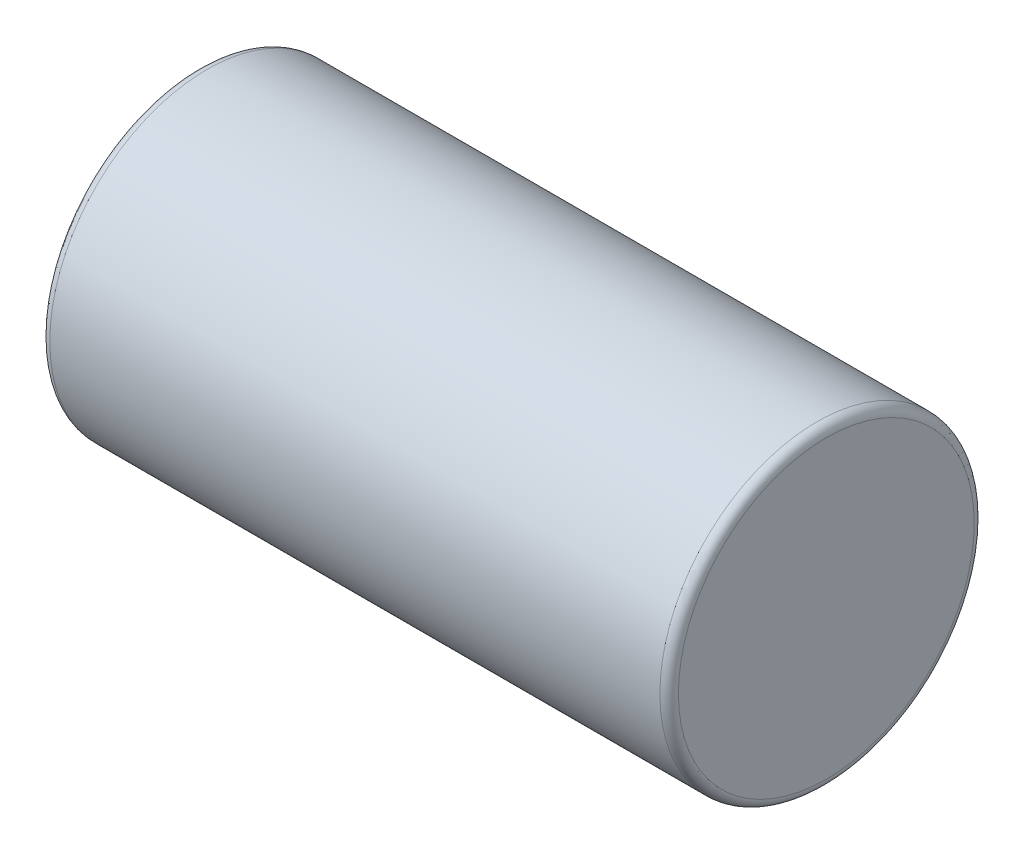
ISO-10303-21;
HEADER;
FILE_DESCRIPTION(('STEP AP214'),'2;1');
FILE_NAME('part.step','',(''),(''),'','','');
FILE_SCHEMA(('AUTOMOTIVE_DESIGN { 1 0 10303 214 1 1 1 1 }'));
ENDSEC;
DATA;
#1=APPLICATION_CONTEXT('core data for automotive mechanical design processes');
#2=APPLICATION_PROTOCOL_DEFINITION('international standard','automotive_design',2000,#1);
#3=PRODUCT_CONTEXT('',#1,'mechanical');
#4=PRODUCT('Part','Part','',(#3));
#5=PRODUCT_RELATED_PRODUCT_CATEGORY('part','',(#4));
#6=PRODUCT_DEFINITION_FORMATION('','',#4);
#7=PRODUCT_DEFINITION_CONTEXT('part definition',#1,'design');
#8=PRODUCT_DEFINITION('design','',#6,#7);
#9=PRODUCT_DEFINITION_SHAPE('','',#8);
#10=(LENGTH_UNIT() NAMED_UNIT(*) SI_UNIT(.MILLI.,.METRE.));
#11=(NAMED_UNIT(*) PLANE_ANGLE_UNIT() SI_UNIT($,.RADIAN.));
#12=(NAMED_UNIT(*) SI_UNIT($,.STERADIAN.) SOLID_ANGLE_UNIT());
#13=UNCERTAINTY_MEASURE_WITH_UNIT(LENGTH_MEASURE(1.E-05),#10,'distance_accuracy_value','');
#14=(GEOMETRIC_REPRESENTATION_CONTEXT(3) GLOBAL_UNCERTAINTY_ASSIGNED_CONTEXT((#13)) GLOBAL_UNIT_ASSIGNED_CONTEXT((#10,
#11,#12)) REPRESENTATION_CONTEXT('',''));
#15=CARTESIAN_POINT('',(0.,0.,0.));
#16=DIRECTION('',(0.,0.,1.));
#17=DIRECTION('',(1.,0.,0.));
#18=AXIS2_PLACEMENT_3D('',#15,#16,#17);
#19=CARTESIAN_POINT('',(-34.,0.,0.));
#20=DIRECTION('',(1.,0.,0.));
#21=DIRECTION('',(0.,0.,-1.));
#22=AXIS2_PLACEMENT_3D('',#19,#20,#21);
#23=CYLINDRICAL_SURFACE('',#22,8.5);
#24=CARTESIAN_POINT('',(-0.5,0.,0.));
#25=DIRECTION('',(1.,0.,0.));
#26=DIRECTION('',(0.,0.,-1.));
#27=AXIS2_PLACEMENT_3D('',#24,#25,#26);
#28=CIRCLE('',#27,8.5);
#29=CARTESIAN_POINT('',(-0.5,0.,-8.5));
#30=VERTEX_POINT('',#29);
#31=EDGE_CURVE('E40',#30,#30,#28,.F.);
#32=ORIENTED_EDGE('',*,*,#31,.T.);
#33=EDGE_LOOP('',(#32));
#34=FACE_BOUND('',#33,.T.);
#35=CARTESIAN_POINT('',(-33.5,0.,0.));
#36=DIRECTION('',(1.,0.,0.));
#37=DIRECTION('',(0.,0.,-1.));
#38=AXIS2_PLACEMENT_3D('',#35,#36,#37);
#39=CIRCLE('',#38,8.5);
#40=CARTESIAN_POINT('',(-33.5,0.,-8.5));
#41=VERTEX_POINT('',#40);
#42=EDGE_CURVE('E44',#41,#41,#39,.T.);
#43=ORIENTED_EDGE('',*,*,#42,.T.);
#44=EDGE_LOOP('',(#43));
#45=FACE_BOUND('',#44,.T.);
#46=ADVANCED_FACE('F33',(#34,#45),#23,.T.);
#47=CARTESIAN_POINT('',(-34.,0.,0.));
#48=DIRECTION('',(1.,0.,0.));
#49=DIRECTION('',(0.,0.,-1.));
#50=AXIS2_PLACEMENT_3D('',#47,#48,#49);
#51=PLANE('',#50);
#52=CARTESIAN_POINT('',(-34.,0.,0.));
#53=DIRECTION('',(1.,0.,0.));
#54=DIRECTION('',(0.,0.,-1.));
#55=AXIS2_PLACEMENT_3D('',#52,#53,#54);
#56=CIRCLE('',#55,8.);
#57=CARTESIAN_POINT('',(-34.,0.,-8.));
#58=VERTEX_POINT('',#57);
#59=EDGE_CURVE('E10',#58,#58,#56,.F.);
#60=ORIENTED_EDGE('',*,*,#59,.T.);
#61=EDGE_LOOP('',(#60));
#62=FACE_BOUND('',#61,.T.);
#63=ADVANCED_FACE('F64',(#62),#51,.F.);
#64=CARTESIAN_POINT('',(0.,0.,0.));
#65=DIRECTION('',(1.,0.,0.));
#66=DIRECTION('',(0.,0.,-1.));
#67=AXIS2_PLACEMENT_3D('',#64,#65,#66);
#68=PLANE('',#67);
#69=CARTESIAN_POINT('',(0.,0.,0.));
#70=DIRECTION('',(1.,0.,0.));
#71=DIRECTION('',(0.,0.,-1.));
#72=AXIS2_PLACEMENT_3D('',#69,#70,#71);
#73=CIRCLE('',#72,8.);
#74=CARTESIAN_POINT('',(0.,0.,-8.));
#75=VERTEX_POINT('',#74);
#76=EDGE_CURVE('E48',#75,#75,#73,.T.);
#77=ORIENTED_EDGE('',*,*,#76,.T.);
#78=EDGE_LOOP('',(#77));
#79=FACE_BOUND('',#78,.T.);
#80=ADVANCED_FACE('F54',(#79),#68,.T.);
#81=CARTESIAN_POINT('',(-0.5,0.,0.));
#82=DIRECTION('',(1.,0.,0.));
#83=DIRECTION('',(0.,0.,-1.));
#84=AXIS2_PLACEMENT_3D('',#81,#82,#83);
#85=TOROIDAL_SURFACE('',#84,8.,0.5);
#86=ORIENTED_EDGE('',*,*,#31,.F.);
#87=EDGE_LOOP('',(#86));
#88=FACE_BOUND('',#87,.T.);
#89=ORIENTED_EDGE('',*,*,#76,.F.);
#90=EDGE_LOOP('',(#89));
#91=FACE_BOUND('',#90,.T.);
#92=ADVANCED_FACE('F56',(#88,#91),#85,.T.);
#93=CARTESIAN_POINT('',(-33.5,0.,0.));
#94=DIRECTION('',(1.,0.,0.));
#95=DIRECTION('',(0.,0.,-1.));
#96=AXIS2_PLACEMENT_3D('',#93,#94,#95);
#97=TOROIDAL_SURFACE('',#96,8.,0.5);
#98=ORIENTED_EDGE('',*,*,#59,.F.);
#99=EDGE_LOOP('',(#98));
#100=FACE_BOUND('',#99,.T.);
#101=ORIENTED_EDGE('',*,*,#42,.F.);
#102=EDGE_LOOP('',(#101));
#103=FACE_BOUND('',#102,.T.);
#104=ADVANCED_FACE('F35',(#100,#103),#97,.T.);
#105=CLOSED_SHELL('',(#46,#63,#80,#92,#104));
#106=MANIFOLD_SOLID_BREP('B2',#105);
#107=ADVANCED_BREP_SHAPE_REPRESENTATION('',(#18,#106),#14);
#108=SHAPE_DEFINITION_REPRESENTATION(#9,#107);
ENDSEC;
END-ISO-10303-21;
